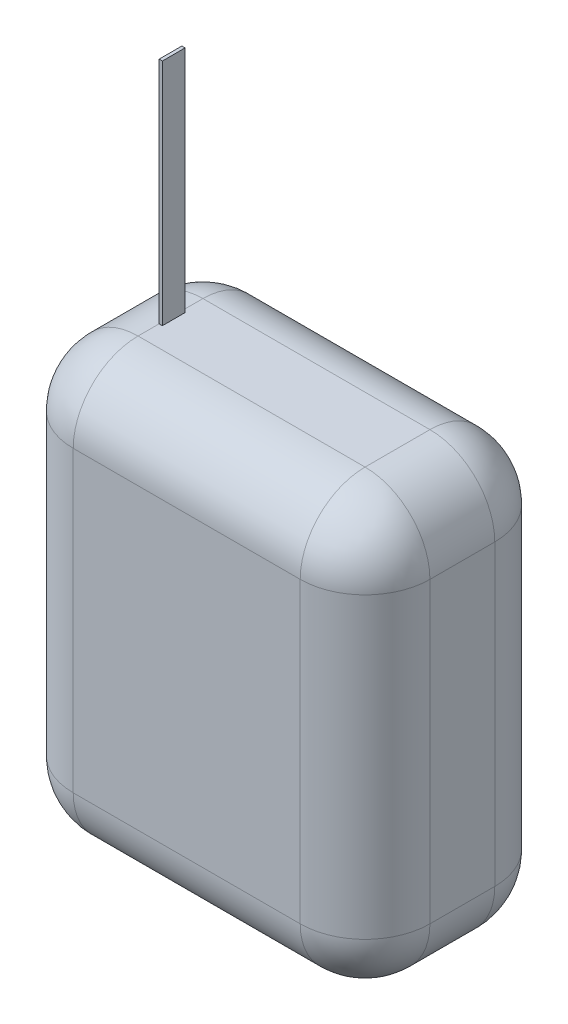
ISO-10303-21;
HEADER;
FILE_DESCRIPTION(('STEP AP214'),'2;1');
FILE_NAME('part.step','',(''),(''),'','','');
FILE_SCHEMA(('AUTOMOTIVE_DESIGN { 1 0 10303 214 1 1 1 1 }'));
ENDSEC;
DATA;
#1=APPLICATION_CONTEXT('core data for automotive mechanical design processes');
#2=APPLICATION_PROTOCOL_DEFINITION('international standard','automotive_design',2000,#1);
#3=PRODUCT_CONTEXT('',#1,'mechanical');
#4=PRODUCT('Part','Part','',(#3));
#5=PRODUCT_RELATED_PRODUCT_CATEGORY('part','',(#4));
#6=PRODUCT_DEFINITION_FORMATION('','',#4);
#7=PRODUCT_DEFINITION_CONTEXT('part definition',#1,'design');
#8=PRODUCT_DEFINITION('design','',#6,#7);
#9=PRODUCT_DEFINITION_SHAPE('','',#8);
#10=(LENGTH_UNIT() NAMED_UNIT(*) SI_UNIT(.MILLI.,.METRE.));
#11=(NAMED_UNIT(*) PLANE_ANGLE_UNIT() SI_UNIT($,.RADIAN.));
#12=(NAMED_UNIT(*) SI_UNIT($,.STERADIAN.) SOLID_ANGLE_UNIT());
#13=UNCERTAINTY_MEASURE_WITH_UNIT(LENGTH_MEASURE(1.E-05),#10,'distance_accuracy_value','');
#14=(GEOMETRIC_REPRESENTATION_CONTEXT(3) GLOBAL_UNCERTAINTY_ASSIGNED_CONTEXT((#13)) GLOBAL_UNIT_ASSIGNED_CONTEXT((#10,
#11,#12)) REPRESENTATION_CONTEXT('',''));
#15=CARTESIAN_POINT('',(0.,0.,0.));
#16=DIRECTION('',(0.,0.,1.));
#17=DIRECTION('',(1.,0.,0.));
#18=AXIS2_PLACEMENT_3D('',#15,#16,#17);
#19=CARTESIAN_POINT('',(-27.5,33.,30.));
#20=DIRECTION('',(0.,-1.,0.));
#21=DIRECTION('',(0.,0.,-1.));
#22=AXIS2_PLACEMENT_3D('',#19,#20,#21);
#23=PLANE('',#22);
#24=DIRECTION('',(0.,0.,1.));
#25=VECTOR('',#24,1.);
#26=CARTESIAN_POINT('',(-17.,33.,0.));
#27=LINE('',#26,#25);
#28=CARTESIAN_POINT('',(-17.,33.,13.25));
#29=VERTEX_POINT('',#28);
#30=CARTESIAN_POINT('',(-17.,33.,16.75));
#31=VERTEX_POINT('',#30);
#32=EDGE_CURVE('E153',#29,#31,#27,.T.);
#33=ORIENTED_EDGE('',*,*,#32,.T.);
#34=DIRECTION('',(-1.,0.,0.));
#35=VECTOR('',#34,1.);
#36=CARTESIAN_POINT('',(-17.,33.,16.75));
#37=LINE('',#36,#35);
#38=CARTESIAN_POINT('',(-17.5,33.,16.75));
#39=VERTEX_POINT('',#38);
#40=EDGE_CURVE('E155',#31,#39,#37,.T.);
#41=ORIENTED_EDGE('',*,*,#40,.T.);
#42=DIRECTION('',(0.,0.,-1.));
#43=VECTOR('',#42,1.);
#44=CARTESIAN_POINT('',(-17.5,33.,30.));
#45=LINE('',#44,#43);
#46=CARTESIAN_POINT('',(-17.5,33.,20.));
#47=VERTEX_POINT('',#46);
#48=EDGE_CURVE('E236',#39,#47,#45,.F.);
#49=ORIENTED_EDGE('',*,*,#48,.T.);
#50=DIRECTION('',(-1.,0.,0.));
#51=VECTOR('',#50,1.);
#52=CARTESIAN_POINT('',(27.5,33.,20.));
#53=LINE('',#52,#51);
#54=CARTESIAN_POINT('',(17.5,33.,20.));
#55=VERTEX_POINT('',#54);
#56=EDGE_CURVE('E47',#47,#55,#53,.F.);
#57=ORIENTED_EDGE('',*,*,#56,.T.);
#58=DIRECTION('',(0.,0.,-1.));
#59=VECTOR('',#58,1.);
#60=CARTESIAN_POINT('',(17.5,33.,30.));
#61=LINE('',#60,#59);
#62=CARTESIAN_POINT('',(17.5,33.,10.));
#63=VERTEX_POINT('',#62);
#64=EDGE_CURVE('E11',#55,#63,#61,.T.);
#65=ORIENTED_EDGE('',*,*,#64,.T.);
#66=DIRECTION('',(-1.,0.,0.));
#67=VECTOR('',#66,1.);
#68=CARTESIAN_POINT('',(-27.5,33.,10.));
#69=LINE('',#68,#67);
#70=CARTESIAN_POINT('',(-17.5,33.,10.));
#71=VERTEX_POINT('',#70);
#72=EDGE_CURVE('E234',#63,#71,#69,.T.);
#73=ORIENTED_EDGE('',*,*,#72,.T.);
#74=CARTESIAN_POINT('',(-17.5,33.,13.25));
#75=VERTEX_POINT('',#74);
#76=EDGE_CURVE('E237',#71,#75,#45,.F.);
#77=ORIENTED_EDGE('',*,*,#76,.T.);
#78=DIRECTION('',(-1.,0.,0.));
#79=VECTOR('',#78,1.);
#80=CARTESIAN_POINT('',(-17.,33.,13.25));
#81=LINE('',#80,#79);
#82=EDGE_CURVE('E55',#29,#75,#81,.T.);
#83=ORIENTED_EDGE('',*,*,#82,.F.);
#84=EDGE_LOOP('',(#33,#41,#49,#57,#65,#73,#77,#83));
#85=FACE_BOUND('',#84,.T.);
#86=ADVANCED_FACE('F38',(#85),#23,.F.);
#87=CARTESIAN_POINT('',(27.5,33.,30.));
#88=DIRECTION('',(-1.,0.,0.));
#89=DIRECTION('',(0.,-1.,0.));
#90=AXIS2_PLACEMENT_3D('',#87,#88,#89);
#91=PLANE('',#90);
#92=DIRECTION('',(0.,0.,-1.));
#93=VECTOR('',#92,1.);
#94=CARTESIAN_POINT('',(27.5,23.,30.));
#95=LINE('',#94,#93);
#96=CARTESIAN_POINT('',(27.5,23.,10.));
#97=VERTEX_POINT('',#96);
#98=CARTESIAN_POINT('',(27.5,23.,20.));
#99=VERTEX_POINT('',#98);
#100=EDGE_CURVE('E198',#97,#99,#95,.F.);
#101=ORIENTED_EDGE('',*,*,#100,.T.);
#102=DIRECTION('',(0.,1.,0.));
#103=VECTOR('',#102,1.);
#104=CARTESIAN_POINT('',(27.5,-33.,20.));
#105=LINE('',#104,#103);
#106=CARTESIAN_POINT('',(27.5,-23.,20.));
#107=VERTEX_POINT('',#106);
#108=EDGE_CURVE('E204',#99,#107,#105,.F.);
#109=ORIENTED_EDGE('',*,*,#108,.T.);
#110=DIRECTION('',(0.,0.,-1.));
#111=VECTOR('',#110,1.);
#112=CARTESIAN_POINT('',(27.5,-23.,30.));
#113=LINE('',#112,#111);
#114=CARTESIAN_POINT('',(27.5,-23.,10.));
#115=VERTEX_POINT('',#114);
#116=EDGE_CURVE('E202',#107,#115,#113,.T.);
#117=ORIENTED_EDGE('',*,*,#116,.T.);
#118=DIRECTION('',(0.,1.,0.));
#119=VECTOR('',#118,1.);
#120=CARTESIAN_POINT('',(27.5,33.,10.));
#121=LINE('',#120,#119);
#122=EDGE_CURVE('E200',#115,#97,#121,.T.);
#123=ORIENTED_EDGE('',*,*,#122,.T.);
#124=EDGE_LOOP('',(#101,#109,#117,#123));
#125=FACE_BOUND('',#124,.T.);
#126=ADVANCED_FACE('F379',(#125),#91,.F.);
#127=CARTESIAN_POINT('',(-27.5,33.,30.));
#128=DIRECTION('',(1.,0.,0.));
#129=DIRECTION('',(0.,1.,0.));
#130=AXIS2_PLACEMENT_3D('',#127,#128,#129);
#131=PLANE('',#130);
#132=DIRECTION('',(0.,0.,-1.));
#133=VECTOR('',#132,1.);
#134=CARTESIAN_POINT('',(-27.5,-23.,30.));
#135=LINE('',#134,#133);
#136=CARTESIAN_POINT('',(-27.5,-23.,10.));
#137=VERTEX_POINT('',#136);
#138=CARTESIAN_POINT('',(-27.5,-23.,20.));
#139=VERTEX_POINT('',#138);
#140=EDGE_CURVE('E229',#137,#139,#135,.F.);
#141=ORIENTED_EDGE('',*,*,#140,.T.);
#142=DIRECTION('',(0.,-1.,0.));
#143=VECTOR('',#142,1.);
#144=CARTESIAN_POINT('',(-27.5,33.,20.));
#145=LINE('',#144,#143);
#146=CARTESIAN_POINT('',(-27.5,23.,20.));
#147=VERTEX_POINT('',#146);
#148=EDGE_CURVE('E231',#139,#147,#145,.F.);
#149=ORIENTED_EDGE('',*,*,#148,.T.);
#150=DIRECTION('',(0.,0.,-1.));
#151=VECTOR('',#150,1.);
#152=CARTESIAN_POINT('',(-27.5,23.,30.));
#153=LINE('',#152,#151);
#154=CARTESIAN_POINT('',(-27.5,23.,10.));
#155=VERTEX_POINT('',#154);
#156=EDGE_CURVE('E225',#147,#155,#153,.T.);
#157=ORIENTED_EDGE('',*,*,#156,.T.);
#158=DIRECTION('',(0.,-1.,0.));
#159=VECTOR('',#158,1.);
#160=CARTESIAN_POINT('',(-27.5,33.,10.));
#161=LINE('',#160,#159);
#162=EDGE_CURVE('E227',#155,#137,#161,.T.);
#163=ORIENTED_EDGE('',*,*,#162,.T.);
#164=EDGE_LOOP('',(#141,#149,#157,#163));
#165=FACE_BOUND('',#164,.T.);
#166=ADVANCED_FACE('F354',(#165),#131,.F.);
#167=CARTESIAN_POINT('',(-27.5,-33.,30.));
#168=DIRECTION('',(0.,1.,0.));
#169=DIRECTION('',(0.,0.,1.));
#170=AXIS2_PLACEMENT_3D('',#167,#168,#169);
#171=PLANE('',#170);
#172=DIRECTION('',(0.,0.,-1.));
#173=VECTOR('',#172,1.);
#174=CARTESIAN_POINT('',(17.5,-33.,30.));
#175=LINE('',#174,#173);
#176=CARTESIAN_POINT('',(17.5,-33.,10.));
#177=VERTEX_POINT('',#176);
#178=CARTESIAN_POINT('',(17.5,-33.,20.));
#179=VERTEX_POINT('',#178);
#180=EDGE_CURVE('E211',#177,#179,#175,.F.);
#181=ORIENTED_EDGE('',*,*,#180,.T.);
#182=DIRECTION('',(1.,0.,0.));
#183=VECTOR('',#182,1.);
#184=CARTESIAN_POINT('',(-27.5,-33.,20.));
#185=LINE('',#184,#183);
#186=CARTESIAN_POINT('',(-17.5,-33.,20.));
#187=VERTEX_POINT('',#186);
#188=EDGE_CURVE('E213',#179,#187,#185,.F.);
#189=ORIENTED_EDGE('',*,*,#188,.T.);
#190=DIRECTION('',(0.,0.,-1.));
#191=VECTOR('',#190,1.);
#192=CARTESIAN_POINT('',(-17.5,-33.,30.));
#193=LINE('',#192,#191);
#194=CARTESIAN_POINT('',(-17.5,-33.,10.));
#195=VERTEX_POINT('',#194);
#196=EDGE_CURVE('E207',#187,#195,#193,.T.);
#197=ORIENTED_EDGE('',*,*,#196,.T.);
#198=DIRECTION('',(1.,0.,0.));
#199=VECTOR('',#198,1.);
#200=CARTESIAN_POINT('',(-27.5,-33.,10.));
#201=LINE('',#200,#199);
#202=EDGE_CURVE('E209',#195,#177,#201,.T.);
#203=ORIENTED_EDGE('',*,*,#202,.T.);
#204=EDGE_LOOP('',(#181,#189,#197,#203));
#205=FACE_BOUND('',#204,.T.);
#206=ADVANCED_FACE('F338',(#205),#171,.F.);
#207=CARTESIAN_POINT('',(0.,0.,30.));
#208=DIRECTION('',(0.,0.,1.));
#209=DIRECTION('',(1.,0.,0.));
#210=AXIS2_PLACEMENT_3D('',#207,#208,#209);
#211=PLANE('',#210);
#212=DIRECTION('',(1.,0.,0.));
#213=VECTOR('',#212,1.);
#214=CARTESIAN_POINT('',(27.5,-23.,30.));
#215=LINE('',#214,#213);
#216=CARTESIAN_POINT('',(-17.5,-23.,30.));
#217=VERTEX_POINT('',#216);
#218=CARTESIAN_POINT('',(17.5,-23.,30.));
#219=VERTEX_POINT('',#218);
#220=EDGE_CURVE('E193',#217,#219,#215,.T.);
#221=ORIENTED_EDGE('',*,*,#220,.T.);
#222=DIRECTION('',(0.,1.,0.));
#223=VECTOR('',#222,1.);
#224=CARTESIAN_POINT('',(17.5,33.,30.));
#225=LINE('',#224,#223);
#226=CARTESIAN_POINT('',(17.5,23.,30.));
#227=VERTEX_POINT('',#226);
#228=EDGE_CURVE('E195',#219,#227,#225,.T.);
#229=ORIENTED_EDGE('',*,*,#228,.T.);
#230=DIRECTION('',(-1.,0.,0.));
#231=VECTOR('',#230,1.);
#232=CARTESIAN_POINT('',(-27.5,23.,30.));
#233=LINE('',#232,#231);
#234=CARTESIAN_POINT('',(-17.5,23.,30.));
#235=VERTEX_POINT('',#234);
#236=EDGE_CURVE('E189',#227,#235,#233,.T.);
#237=ORIENTED_EDGE('',*,*,#236,.T.);
#238=DIRECTION('',(0.,-1.,0.));
#239=VECTOR('',#238,1.);
#240=CARTESIAN_POINT('',(-17.5,-33.,30.));
#241=LINE('',#240,#239);
#242=EDGE_CURVE('E191',#235,#217,#241,.T.);
#243=ORIENTED_EDGE('',*,*,#242,.T.);
#244=EDGE_LOOP('',(#221,#229,#237,#243));
#245=FACE_BOUND('',#244,.T.);
#246=ADVANCED_FACE('F392',(#245),#211,.T.);
#247=CARTESIAN_POINT('',(0.,0.,0.));
#248=DIRECTION('',(0.,0.,1.));
#249=DIRECTION('',(1.,0.,0.));
#250=AXIS2_PLACEMENT_3D('',#247,#248,#249);
#251=PLANE('',#250);
#252=DIRECTION('',(0.,1.,0.));
#253=VECTOR('',#252,1.);
#254=CARTESIAN_POINT('',(17.5,0.,0.));
#255=LINE('',#254,#253);
#256=CARTESIAN_POINT('',(17.5,23.,0.));
#257=VERTEX_POINT('',#256);
#258=CARTESIAN_POINT('',(17.5,-23.,0.));
#259=VERTEX_POINT('',#258);
#260=EDGE_CURVE('E220',#257,#259,#255,.F.);
#261=ORIENTED_EDGE('',*,*,#260,.T.);
#262=DIRECTION('',(1.,0.,0.));
#263=VECTOR('',#262,1.);
#264=CARTESIAN_POINT('',(0.,-23.,0.));
#265=LINE('',#264,#263);
#266=CARTESIAN_POINT('',(-17.5,-23.,0.));
#267=VERTEX_POINT('',#266);
#268=EDGE_CURVE('E222',#259,#267,#265,.F.);
#269=ORIENTED_EDGE('',*,*,#268,.T.);
#270=DIRECTION('',(0.,-1.,0.));
#271=VECTOR('',#270,1.);
#272=CARTESIAN_POINT('',(-17.5,0.,0.));
#273=LINE('',#272,#271);
#274=CARTESIAN_POINT('',(-17.5,23.,0.));
#275=VERTEX_POINT('',#274);
#276=EDGE_CURVE('E218',#267,#275,#273,.F.);
#277=ORIENTED_EDGE('',*,*,#276,.T.);
#278=DIRECTION('',(-1.,0.,0.));
#279=VECTOR('',#278,1.);
#280=CARTESIAN_POINT('',(0.,23.,0.));
#281=LINE('',#280,#279);
#282=EDGE_CURVE('E216',#275,#257,#281,.F.);
#283=ORIENTED_EDGE('',*,*,#282,.T.);
#284=EDGE_LOOP('',(#261,#269,#277,#283));
#285=FACE_BOUND('',#284,.T.);
#286=ADVANCED_FACE('F317',(#285),#251,.F.);
#287=CARTESIAN_POINT('',(-17.5,33.,10.));
#288=DIRECTION('',(0.,-1.,0.));
#289=DIRECTION('',(1.,0.,0.));
#290=AXIS2_PLACEMENT_3D('',#287,#288,#289);
#291=CYLINDRICAL_SURFACE('',#290,10.);
#292=CARTESIAN_POINT('',(-17.5,-23.,10.));
#293=DIRECTION('',(0.,-1.,0.));
#294=DIRECTION('',(0.,0.,-1.));
#295=AXIS2_PLACEMENT_3D('',#292,#293,#294);
#296=CIRCLE('',#295,10.);
#297=EDGE_CURVE('E42',#137,#267,#296,.T.);
#298=ORIENTED_EDGE('',*,*,#297,.F.);
#299=ORIENTED_EDGE('',*,*,#162,.F.);
#300=CARTESIAN_POINT('',(-17.5,23.,10.));
#301=DIRECTION('',(0.,1.,0.));
#302=DIRECTION('',(0.,0.,1.));
#303=AXIS2_PLACEMENT_3D('',#300,#301,#302);
#304=CIRCLE('',#303,10.);
#305=EDGE_CURVE('E298',#275,#155,#304,.T.);
#306=ORIENTED_EDGE('',*,*,#305,.F.);
#307=ORIENTED_EDGE('',*,*,#276,.F.);
#308=EDGE_LOOP('',(#298,#299,#306,#307));
#309=FACE_BOUND('',#308,.T.);
#310=ADVANCED_FACE('F40',(#309),#291,.T.);
#311=CARTESIAN_POINT('',(-17.5,-23.,10.));
#312=DIRECTION('',(0.,0.,-1.));
#313=DIRECTION('',(-1.,0.,0.));
#314=AXIS2_PLACEMENT_3D('',#311,#312,#313);
#315=SPHERICAL_SURFACE('',#314,10.);
#316=CARTESIAN_POINT('',(-17.5,-23.,10.));
#317=DIRECTION('',(0.,0.,-1.));
#318=DIRECTION('',(-1.,0.,0.));
#319=AXIS2_PLACEMENT_3D('',#316,#317,#318);
#320=CIRCLE('',#319,10.);
#321=EDGE_CURVE('E294',#137,#195,#320,.F.);
#322=ORIENTED_EDGE('',*,*,#321,.F.);
#323=ORIENTED_EDGE('',*,*,#297,.T.);
#324=CARTESIAN_POINT('',(-17.5,-23.,10.));
#325=DIRECTION('',(-1.,0.,0.));
#326=DIRECTION('',(0.,0.,1.));
#327=AXIS2_PLACEMENT_3D('',#324,#325,#326);
#328=CIRCLE('',#327,10.);
#329=EDGE_CURVE('E297',#195,#267,#328,.F.);
#330=ORIENTED_EDGE('',*,*,#329,.F.);
#331=EDGE_LOOP('',(#322,#323,#330));
#332=FACE_BOUND('',#331,.T.);
#333=ADVANCED_FACE('F310',(#332),#315,.T.);
#334=CARTESIAN_POINT('',(-17.5,23.,10.));
#335=DIRECTION('',(-1.,0.,0.));
#336=DIRECTION('',(0.,0.,1.));
#337=AXIS2_PLACEMENT_3D('',#334,#335,#336);
#338=SPHERICAL_SURFACE('',#337,10.);
#339=CARTESIAN_POINT('',(-17.5,23.,10.));
#340=DIRECTION('',(-1.,0.,0.));
#341=DIRECTION('',(0.,0.,1.));
#342=AXIS2_PLACEMENT_3D('',#339,#340,#341);
#343=CIRCLE('',#342,10.);
#344=EDGE_CURVE('E288',#275,#71,#343,.F.);
#345=ORIENTED_EDGE('',*,*,#344,.F.);
#346=ORIENTED_EDGE('',*,*,#305,.T.);
#347=CARTESIAN_POINT('',(-17.5,23.,10.));
#348=DIRECTION('',(0.,0.,-1.));
#349=DIRECTION('',(-1.,0.,0.));
#350=AXIS2_PLACEMENT_3D('',#347,#348,#349);
#351=CIRCLE('',#350,10.);
#352=EDGE_CURVE('E291',#71,#155,#351,.F.);
#353=ORIENTED_EDGE('',*,*,#352,.F.);
#354=EDGE_LOOP('',(#345,#346,#353));
#355=FACE_BOUND('',#354,.T.);
#356=ADVANCED_FACE('F364',(#355),#338,.T.);
#357=CARTESIAN_POINT('',(-27.5,-23.,10.));
#358=DIRECTION('',(1.,0.,0.));
#359=DIRECTION('',(0.,0.,-1.));
#360=AXIS2_PLACEMENT_3D('',#357,#358,#359);
#361=CYLINDRICAL_SURFACE('',#360,10.);
#362=ORIENTED_EDGE('',*,*,#329,.T.);
#363=ORIENTED_EDGE('',*,*,#268,.F.);
#364=CARTESIAN_POINT('',(17.5,-23.,10.));
#365=DIRECTION('',(1.,0.,0.));
#366=DIRECTION('',(0.,0.,-1.));
#367=AXIS2_PLACEMENT_3D('',#364,#365,#366);
#368=CIRCLE('',#367,10.);
#369=EDGE_CURVE('E282',#177,#259,#368,.T.);
#370=ORIENTED_EDGE('',*,*,#369,.F.);
#371=ORIENTED_EDGE('',*,*,#202,.F.);
#372=EDGE_LOOP('',(#362,#363,#370,#371));
#373=FACE_BOUND('',#372,.T.);
#374=ADVANCED_FACE('F322',(#373),#361,.T.);
#375=CARTESIAN_POINT('',(-17.5,-23.,30.));
#376=DIRECTION('',(0.,0.,-1.));
#377=DIRECTION('',(-1.,0.,0.));
#378=AXIS2_PLACEMENT_3D('',#375,#376,#377);
#379=CYLINDRICAL_SURFACE('',#378,10.);
#380=ORIENTED_EDGE('',*,*,#321,.T.);
#381=ORIENTED_EDGE('',*,*,#196,.F.);
#382=CARTESIAN_POINT('',(-17.5,-23.,20.));
#383=DIRECTION('',(0.,0.,1.));
#384=DIRECTION('',(1.,0.,0.));
#385=AXIS2_PLACEMENT_3D('',#382,#383,#384);
#386=CIRCLE('',#385,10.);
#387=EDGE_CURVE('E279',#139,#187,#386,.T.);
#388=ORIENTED_EDGE('',*,*,#387,.F.);
#389=ORIENTED_EDGE('',*,*,#140,.F.);
#390=EDGE_LOOP('',(#380,#381,#388,#389));
#391=FACE_BOUND('',#390,.T.);
#392=ADVANCED_FACE('F351',(#391),#379,.T.);
#393=CARTESIAN_POINT('',(-17.5,0.,20.));
#394=DIRECTION('',(0.,1.,0.));
#395=DIRECTION('',(-1.,0.,0.));
#396=AXIS2_PLACEMENT_3D('',#393,#394,#395);
#397=CYLINDRICAL_SURFACE('',#396,10.);
#398=CARTESIAN_POINT('',(-17.5,23.,20.));
#399=DIRECTION('',(0.,1.,0.));
#400=DIRECTION('',(0.,0.,1.));
#401=AXIS2_PLACEMENT_3D('',#398,#399,#400);
#402=CIRCLE('',#401,10.);
#403=EDGE_CURVE('E273',#147,#235,#402,.T.);
#404=ORIENTED_EDGE('',*,*,#403,.F.);
#405=ORIENTED_EDGE('',*,*,#148,.F.);
#406=CARTESIAN_POINT('',(-17.5,-23.,20.));
#407=DIRECTION('',(0.,-1.,0.));
#408=DIRECTION('',(0.,0.,-1.));
#409=AXIS2_PLACEMENT_3D('',#406,#407,#408);
#410=CIRCLE('',#409,10.);
#411=EDGE_CURVE('E276',#217,#139,#410,.T.);
#412=ORIENTED_EDGE('',*,*,#411,.F.);
#413=ORIENTED_EDGE('',*,*,#242,.F.);
#414=EDGE_LOOP('',(#404,#405,#412,#413));
#415=FACE_BOUND('',#414,.T.);
#416=ADVANCED_FACE('F357',(#415),#397,.T.);
#417=CARTESIAN_POINT('',(-17.5,23.,30.));
#418=DIRECTION('',(0.,0.,-1.));
#419=DIRECTION('',(-1.,0.,0.));
#420=AXIS2_PLACEMENT_3D('',#417,#418,#419);
#421=CYLINDRICAL_SURFACE('',#420,10.);
#422=ORIENTED_EDGE('',*,*,#352,.T.);
#423=ORIENTED_EDGE('',*,*,#156,.F.);
#424=CARTESIAN_POINT('',(-17.5,23.,20.));
#425=DIRECTION('',(0.,0.,1.));
#426=DIRECTION('',(1.,0.,0.));
#427=AXIS2_PLACEMENT_3D('',#424,#425,#426);
#428=CIRCLE('',#427,10.);
#429=EDGE_CURVE('E271',#47,#147,#428,.T.);
#430=ORIENTED_EDGE('',*,*,#429,.F.);
#431=ORIENTED_EDGE('',*,*,#48,.F.);
#432=EDGE_CURVE('E63',#75,#39,#45,.F.);
#433=ORIENTED_EDGE('',*,*,#432,.F.);
#434=ORIENTED_EDGE('',*,*,#76,.F.);
#435=EDGE_LOOP('',(#422,#423,#430,#431,#433,#434));
#436=FACE_BOUND('',#435,.T.);
#437=ADVANCED_FACE('F363',(#436),#421,.T.);
#438=CARTESIAN_POINT('',(-27.5,23.,10.));
#439=DIRECTION('',(-1.,0.,0.));
#440=DIRECTION('',(0.,0.,1.));
#441=AXIS2_PLACEMENT_3D('',#438,#439,#440);
#442=CYLINDRICAL_SURFACE('',#441,10.);
#443=ORIENTED_EDGE('',*,*,#344,.T.);
#444=ORIENTED_EDGE('',*,*,#72,.F.);
#445=CARTESIAN_POINT('',(17.5,23.,10.));
#446=DIRECTION('',(1.,0.,0.));
#447=DIRECTION('',(0.,1.,0.));
#448=AXIS2_PLACEMENT_3D('',#445,#446,#447);
#449=CIRCLE('',#448,10.);
#450=EDGE_CURVE('E268',#257,#63,#449,.T.);
#451=ORIENTED_EDGE('',*,*,#450,.F.);
#452=ORIENTED_EDGE('',*,*,#282,.F.);
#453=EDGE_LOOP('',(#443,#444,#451,#452));
#454=FACE_BOUND('',#453,.T.);
#455=ADVANCED_FACE('F368',(#454),#442,.T.);
#456=CARTESIAN_POINT('',(17.5,33.,10.));
#457=DIRECTION('',(0.,1.,0.));
#458=DIRECTION('',(-1.,0.,0.));
#459=AXIS2_PLACEMENT_3D('',#456,#457,#458);
#460=CYLINDRICAL_SURFACE('',#459,10.);
#461=CARTESIAN_POINT('',(17.5,-23.,10.));
#462=DIRECTION('',(0.,-1.,0.));
#463=DIRECTION('',(0.,0.,-1.));
#464=AXIS2_PLACEMENT_3D('',#461,#462,#463);
#465=CIRCLE('',#464,10.);
#466=EDGE_CURVE('E285',#259,#115,#465,.T.);
#467=ORIENTED_EDGE('',*,*,#466,.F.);
#468=ORIENTED_EDGE('',*,*,#260,.F.);
#469=CARTESIAN_POINT('',(17.5,23.,10.));
#470=DIRECTION('',(0.,1.,0.));
#471=DIRECTION('',(0.,0.,1.));
#472=AXIS2_PLACEMENT_3D('',#469,#470,#471);
#473=CIRCLE('',#472,10.);
#474=EDGE_CURVE('E265',#97,#257,#473,.T.);
#475=ORIENTED_EDGE('',*,*,#474,.F.);
#476=ORIENTED_EDGE('',*,*,#122,.F.);
#477=EDGE_LOOP('',(#467,#468,#475,#476));
#478=FACE_BOUND('',#477,.T.);
#479=ADVANCED_FACE('F326',(#478),#460,.T.);
#480=CARTESIAN_POINT('',(17.5,-23.,10.));
#481=DIRECTION('',(0.,0.,-1.));
#482=DIRECTION('',(-1.,0.,0.));
#483=AXIS2_PLACEMENT_3D('',#480,#481,#482);
#484=SPHERICAL_SURFACE('',#483,10.);
#485=ORIENTED_EDGE('',*,*,#369,.T.);
#486=ORIENTED_EDGE('',*,*,#466,.T.);
#487=CARTESIAN_POINT('',(17.5,-23.,10.));
#488=DIRECTION('',(0.,0.,-1.));
#489=DIRECTION('',(-1.,0.,0.));
#490=AXIS2_PLACEMENT_3D('',#487,#488,#489);
#491=CIRCLE('',#490,10.);
#492=EDGE_CURVE('E262',#177,#115,#491,.F.);
#493=ORIENTED_EDGE('',*,*,#492,.F.);
#494=EDGE_LOOP('',(#485,#486,#493));
#495=FACE_BOUND('',#494,.T.);
#496=ADVANCED_FACE('F330',(#495),#484,.T.);
#497=CARTESIAN_POINT('',(-17.5,-23.,20.));
#498=DIRECTION('',(-1.,0.,0.));
#499=DIRECTION('',(0.,0.,1.));
#500=AXIS2_PLACEMENT_3D('',#497,#498,#499);
#501=SPHERICAL_SURFACE('',#500,10.);
#502=ORIENTED_EDGE('',*,*,#411,.T.);
#503=ORIENTED_EDGE('',*,*,#387,.T.);
#504=CARTESIAN_POINT('',(-17.5,-23.,20.));
#505=DIRECTION('',(-1.,0.,0.));
#506=DIRECTION('',(0.,0.,1.));
#507=AXIS2_PLACEMENT_3D('',#504,#505,#506);
#508=CIRCLE('',#507,10.);
#509=EDGE_CURVE('E260',#217,#187,#508,.F.);
#510=ORIENTED_EDGE('',*,*,#509,.F.);
#511=EDGE_LOOP('',(#502,#503,#510));
#512=FACE_BOUND('',#511,.T.);
#513=ADVANCED_FACE('F348',(#512),#501,.T.);
#514=CARTESIAN_POINT('',(-17.5,23.,20.));
#515=DIRECTION('',(-1.,0.,0.));
#516=DIRECTION('',(0.,0.,1.));
#517=AXIS2_PLACEMENT_3D('',#514,#515,#516);
#518=SPHERICAL_SURFACE('',#517,10.);
#519=ORIENTED_EDGE('',*,*,#429,.T.);
#520=ORIENTED_EDGE('',*,*,#403,.T.);
#521=CARTESIAN_POINT('',(-17.5,23.,20.));
#522=DIRECTION('',(-1.,0.,0.));
#523=DIRECTION('',(0.,0.,1.));
#524=AXIS2_PLACEMENT_3D('',#521,#522,#523);
#525=CIRCLE('',#524,10.);
#526=EDGE_CURVE('E257',#47,#235,#525,.F.);
#527=ORIENTED_EDGE('',*,*,#526,.F.);
#528=EDGE_LOOP('',(#519,#520,#527));
#529=FACE_BOUND('',#528,.T.);
#530=ADVANCED_FACE('F429',(#529),#518,.T.);
#531=CARTESIAN_POINT('',(17.5,23.,10.));
#532=DIRECTION('',(0.,0.,-1.));
#533=DIRECTION('',(-1.,0.,0.));
#534=AXIS2_PLACEMENT_3D('',#531,#532,#533);
#535=SPHERICAL_SURFACE('',#534,10.);
#536=ORIENTED_EDGE('',*,*,#474,.T.);
#537=ORIENTED_EDGE('',*,*,#450,.T.);
#538=CARTESIAN_POINT('',(17.5,23.,10.));
#539=DIRECTION('',(0.,0.,-1.));
#540=DIRECTION('',(-1.,0.,0.));
#541=AXIS2_PLACEMENT_3D('',#538,#539,#540);
#542=CIRCLE('',#541,10.);
#543=EDGE_CURVE('E255',#97,#63,#542,.F.);
#544=ORIENTED_EDGE('',*,*,#543,.F.);
#545=EDGE_LOOP('',(#536,#537,#544));
#546=FACE_BOUND('',#545,.T.);
#547=ADVANCED_FACE('F371',(#546),#535,.T.);
#548=CARTESIAN_POINT('',(17.5,-23.,30.));
#549=DIRECTION('',(0.,0.,-1.));
#550=DIRECTION('',(-1.,0.,0.));
#551=AXIS2_PLACEMENT_3D('',#548,#549,#550);
#552=CYLINDRICAL_SURFACE('',#551,10.);
#553=ORIENTED_EDGE('',*,*,#492,.T.);
#554=ORIENTED_EDGE('',*,*,#116,.F.);
#555=CARTESIAN_POINT('',(17.5,-23.,20.));
#556=DIRECTION('',(0.,0.,1.));
#557=DIRECTION('',(1.,0.,0.));
#558=AXIS2_PLACEMENT_3D('',#555,#556,#557);
#559=CIRCLE('',#558,10.);
#560=EDGE_CURVE('E252',#179,#107,#559,.T.);
#561=ORIENTED_EDGE('',*,*,#560,.F.);
#562=ORIENTED_EDGE('',*,*,#180,.F.);
#563=EDGE_LOOP('',(#553,#554,#561,#562));
#564=FACE_BOUND('',#563,.T.);
#565=ADVANCED_FACE('F335',(#564),#552,.T.);
#566=CARTESIAN_POINT('',(0.,-23.,20.));
#567=DIRECTION('',(-1.,0.,0.));
#568=DIRECTION('',(0.,0.,1.));
#569=AXIS2_PLACEMENT_3D('',#566,#567,#568);
#570=CYLINDRICAL_SURFACE('',#569,10.);
#571=ORIENTED_EDGE('',*,*,#509,.T.);
#572=ORIENTED_EDGE('',*,*,#188,.F.);
#573=CARTESIAN_POINT('',(17.5,-23.,20.));
#574=DIRECTION('',(1.,0.,0.));
#575=DIRECTION('',(0.,0.,-1.));
#576=AXIS2_PLACEMENT_3D('',#573,#574,#575);
#577=CIRCLE('',#576,10.);
#578=EDGE_CURVE('E249',#219,#179,#577,.T.);
#579=ORIENTED_EDGE('',*,*,#578,.F.);
#580=ORIENTED_EDGE('',*,*,#220,.F.);
#581=EDGE_LOOP('',(#571,#572,#579,#580));
#582=FACE_BOUND('',#581,.T.);
#583=ADVANCED_FACE('F341',(#582),#570,.T.);
#584=CARTESIAN_POINT('',(0.,23.,20.));
#585=DIRECTION('',(1.,0.,0.));
#586=DIRECTION('',(0.,0.,-1.));
#587=AXIS2_PLACEMENT_3D('',#584,#585,#586);
#588=CYLINDRICAL_SURFACE('',#587,10.);
#589=ORIENTED_EDGE('',*,*,#526,.T.);
#590=ORIENTED_EDGE('',*,*,#236,.F.);
#591=CARTESIAN_POINT('',(17.5,23.,20.));
#592=DIRECTION('',(1.,0.,0.));
#593=DIRECTION('',(0.,0.,-1.));
#594=AXIS2_PLACEMENT_3D('',#591,#592,#593);
#595=CIRCLE('',#594,10.);
#596=EDGE_CURVE('E246',#55,#227,#595,.T.);
#597=ORIENTED_EDGE('',*,*,#596,.F.);
#598=ORIENTED_EDGE('',*,*,#56,.F.);
#599=EDGE_LOOP('',(#589,#590,#597,#598));
#600=FACE_BOUND('',#599,.T.);
#601=ADVANCED_FACE('F390',(#600),#588,.T.);
#602=CARTESIAN_POINT('',(17.5,23.,30.));
#603=DIRECTION('',(0.,0.,-1.));
#604=DIRECTION('',(-1.,0.,0.));
#605=AXIS2_PLACEMENT_3D('',#602,#603,#604);
#606=CYLINDRICAL_SURFACE('',#605,10.);
#607=ORIENTED_EDGE('',*,*,#543,.T.);
#608=ORIENTED_EDGE('',*,*,#64,.F.);
#609=CARTESIAN_POINT('',(17.5,23.,20.));
#610=DIRECTION('',(0.,0.,1.));
#611=DIRECTION('',(1.,0.,0.));
#612=AXIS2_PLACEMENT_3D('',#609,#610,#611);
#613=CIRCLE('',#612,10.);
#614=EDGE_CURVE('E243',#99,#55,#613,.T.);
#615=ORIENTED_EDGE('',*,*,#614,.F.);
#616=ORIENTED_EDGE('',*,*,#100,.F.);
#617=EDGE_LOOP('',(#607,#608,#615,#616));
#618=FACE_BOUND('',#617,.T.);
#619=ADVANCED_FACE('F376',(#618),#606,.T.);
#620=CARTESIAN_POINT('',(17.5,-23.,20.));
#621=DIRECTION('',(0.,-1.,0.));
#622=DIRECTION('',(0.,0.,-1.));
#623=AXIS2_PLACEMENT_3D('',#620,#621,#622);
#624=SPHERICAL_SURFACE('',#623,10.);
#625=ORIENTED_EDGE('',*,*,#578,.T.);
#626=ORIENTED_EDGE('',*,*,#560,.T.);
#627=CARTESIAN_POINT('',(17.5,-23.,20.));
#628=DIRECTION('',(0.,-1.,0.));
#629=DIRECTION('',(0.,0.,-1.));
#630=AXIS2_PLACEMENT_3D('',#627,#628,#629);
#631=CIRCLE('',#630,10.);
#632=EDGE_CURVE('E241',#219,#107,#631,.F.);
#633=ORIENTED_EDGE('',*,*,#632,.F.);
#634=EDGE_LOOP('',(#625,#626,#633));
#635=FACE_BOUND('',#634,.T.);
#636=ADVANCED_FACE('F415',(#635),#624,.T.);
#637=CARTESIAN_POINT('',(17.5,23.,20.));
#638=DIRECTION('',(0.,1.,0.));
#639=DIRECTION('',(-1.,0.,0.));
#640=AXIS2_PLACEMENT_3D('',#637,#638,#639);
#641=SPHERICAL_SURFACE('',#640,10.);
#642=ORIENTED_EDGE('',*,*,#614,.T.);
#643=ORIENTED_EDGE('',*,*,#596,.T.);
#644=CARTESIAN_POINT('',(17.5,23.,20.));
#645=DIRECTION('',(0.,1.,0.));
#646=DIRECTION('',(0.,0.,1.));
#647=AXIS2_PLACEMENT_3D('',#644,#645,#646);
#648=CIRCLE('',#647,10.);
#649=EDGE_CURVE('E186',#99,#227,#648,.F.);
#650=ORIENTED_EDGE('',*,*,#649,.F.);
#651=EDGE_LOOP('',(#642,#643,#650));
#652=FACE_BOUND('',#651,.T.);
#653=ADVANCED_FACE('F385',(#652),#641,.T.);
#654=CARTESIAN_POINT('',(17.5,0.,20.));
#655=DIRECTION('',(0.,-1.,0.));
#656=DIRECTION('',(1.,0.,0.));
#657=AXIS2_PLACEMENT_3D('',#654,#655,#656);
#658=CYLINDRICAL_SURFACE('',#657,10.);
#659=ORIENTED_EDGE('',*,*,#632,.T.);
#660=ORIENTED_EDGE('',*,*,#108,.F.);
#661=ORIENTED_EDGE('',*,*,#649,.T.);
#662=ORIENTED_EDGE('',*,*,#228,.F.);
#663=EDGE_LOOP('',(#659,#660,#661,#662));
#664=FACE_BOUND('',#663,.T.);
#665=ADVANCED_FACE('F382',(#664),#658,.T.);
#666=CARTESIAN_POINT('',(-17.,68.3505628867816,0.));
#667=DIRECTION('',(0.,-1.,0.));
#668=DIRECTION('',(0.,0.,-1.));
#669=AXIS2_PLACEMENT_3D('',#666,#667,#668);
#670=PLANE('',#669);
#671=DIRECTION('',(0.,0.,1.));
#672=VECTOR('',#671,1.);
#673=CARTESIAN_POINT('',(-17.5,68.3505628867816,0.));
#674=LINE('',#673,#672);
#675=CARTESIAN_POINT('',(-17.5,68.3505628867816,13.25));
#676=VERTEX_POINT('',#675);
#677=CARTESIAN_POINT('',(-17.5,68.3505628867816,16.75));
#678=VERTEX_POINT('',#677);
#679=EDGE_CURVE('E178',#676,#678,#674,.T.);
#680=ORIENTED_EDGE('',*,*,#679,.T.);
#681=DIRECTION('',(-1.,0.,0.));
#682=VECTOR('',#681,1.);
#683=CARTESIAN_POINT('',(-17.,68.3505628867816,16.75));
#684=LINE('',#683,#682);
#685=CARTESIAN_POINT('',(-17.,68.3505628867816,16.75));
#686=VERTEX_POINT('',#685);
#687=EDGE_CURVE('E169',#686,#678,#684,.T.);
#688=ORIENTED_EDGE('',*,*,#687,.F.);
#689=DIRECTION('',(0.,0.,1.));
#690=VECTOR('',#689,1.);
#691=CARTESIAN_POINT('',(-17.,68.3505628867816,0.));
#692=LINE('',#691,#690);
#693=CARTESIAN_POINT('',(-17.,68.3505628867816,13.25));
#694=VERTEX_POINT('',#693);
#695=EDGE_CURVE('E173',#694,#686,#692,.T.);
#696=ORIENTED_EDGE('',*,*,#695,.F.);
#697=DIRECTION('',(-1.,0.,0.));
#698=VECTOR('',#697,1.);
#699=CARTESIAN_POINT('',(-17.,68.3505628867816,13.25));
#700=LINE('',#699,#698);
#701=EDGE_CURVE('E158',#694,#676,#700,.T.);
#702=ORIENTED_EDGE('',*,*,#701,.T.);
#703=EDGE_LOOP('',(#680,#688,#696,#702));
#704=FACE_BOUND('',#703,.T.);
#705=ADVANCED_FACE('F412',(#704),#670,.F.);
#706=CARTESIAN_POINT('',(-17.,0.,13.25));
#707=DIRECTION('',(0.,0.,1.));
#708=DIRECTION('',(1.,0.,0.));
#709=AXIS2_PLACEMENT_3D('',#706,#707,#708);
#710=PLANE('',#709);
#711=DIRECTION('',(0.,1.,0.));
#712=VECTOR('',#711,1.);
#713=CARTESIAN_POINT('',(-17.5,0.,13.25));
#714=LINE('',#713,#712);
#715=EDGE_CURVE('E181',#75,#676,#714,.T.);
#716=ORIENTED_EDGE('',*,*,#715,.T.);
#717=ORIENTED_EDGE('',*,*,#701,.F.);
#718=DIRECTION('',(0.,1.,0.));
#719=VECTOR('',#718,1.);
#720=CARTESIAN_POINT('',(-17.,0.,13.25));
#721=LINE('',#720,#719);
#722=EDGE_CURVE('E159',#29,#694,#721,.T.);
#723=ORIENTED_EDGE('',*,*,#722,.F.);
#724=ORIENTED_EDGE('',*,*,#82,.T.);
#725=EDGE_LOOP('',(#716,#717,#723,#724));
#726=FACE_BOUND('',#725,.T.);
#727=ADVANCED_FACE('F590',(#726),#710,.F.);
#728=CARTESIAN_POINT('',(-17.,0.,0.));
#729=DIRECTION('',(-1.,0.,0.));
#730=DIRECTION('',(0.,0.,1.));
#731=AXIS2_PLACEMENT_3D('',#728,#729,#730);
#732=PLANE('',#731);
#733=ORIENTED_EDGE('',*,*,#695,.T.);
#734=DIRECTION('',(0.,1.,0.));
#735=VECTOR('',#734,1.);
#736=CARTESIAN_POINT('',(-17.,0.,16.75));
#737=LINE('',#736,#735);
#738=EDGE_CURVE('E166',#31,#686,#737,.T.);
#739=ORIENTED_EDGE('',*,*,#738,.F.);
#740=ORIENTED_EDGE('',*,*,#32,.F.);
#741=ORIENTED_EDGE('',*,*,#722,.T.);
#742=EDGE_LOOP('',(#733,#739,#740,#741));
#743=FACE_BOUND('',#742,.T.);
#744=ADVANCED_FACE('F171',(#743),#732,.F.);
#745=CARTESIAN_POINT('',(-17.5,0.,0.));
#746=DIRECTION('',(-1.,0.,0.));
#747=DIRECTION('',(0.,0.,1.));
#748=AXIS2_PLACEMENT_3D('',#745,#746,#747);
#749=PLANE('',#748);
#750=ORIENTED_EDGE('',*,*,#679,.F.);
#751=ORIENTED_EDGE('',*,*,#715,.F.);
#752=ORIENTED_EDGE('',*,*,#432,.T.);
#753=DIRECTION('',(0.,1.,0.));
#754=VECTOR('',#753,1.);
#755=CARTESIAN_POINT('',(-17.5,0.,16.75));
#756=LINE('',#755,#754);
#757=EDGE_CURVE('E168',#39,#678,#756,.T.);
#758=ORIENTED_EDGE('',*,*,#757,.T.);
#759=EDGE_LOOP('',(#750,#751,#752,#758));
#760=FACE_BOUND('',#759,.T.);
#761=ADVANCED_FACE('F607',(#760),#749,.T.);
#762=CARTESIAN_POINT('',(-17.,0.,16.75));
#763=DIRECTION('',(0.,0.,1.));
#764=DIRECTION('',(1.,0.,0.));
#765=AXIS2_PLACEMENT_3D('',#762,#763,#764);
#766=PLANE('',#765);
#767=ORIENTED_EDGE('',*,*,#757,.F.);
#768=ORIENTED_EDGE('',*,*,#40,.F.);
#769=ORIENTED_EDGE('',*,*,#738,.T.);
#770=ORIENTED_EDGE('',*,*,#687,.T.);
#771=EDGE_LOOP('',(#767,#768,#769,#770));
#772=FACE_BOUND('',#771,.T.);
#773=ADVANCED_FACE('F164',(#772),#766,.T.);
#774=CLOSED_SHELL('',(#86,#126,#166,#206,#246,#286,#310,#333,#356,#374,#392,#416,#437,#455,#479,
#496,#513,#530,#547,#565,#583,#601,#619,#636,#653,#665,#705,#727,#744,#761,#773));
#775=MANIFOLD_SOLID_BREP('B2',#774);
#776=ADVANCED_BREP_SHAPE_REPRESENTATION('',(#18,#775),#14);
#777=SHAPE_DEFINITION_REPRESENTATION(#9,#776);
ENDSEC;
END-ISO-10303-21;
